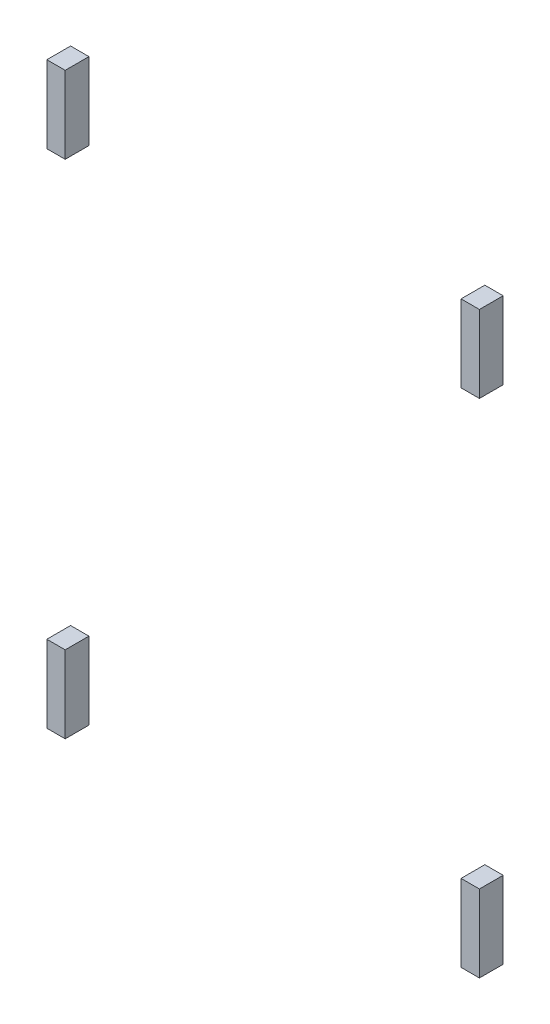
ISO-10303-21;
HEADER;
FILE_DESCRIPTION(('STEP AP214'),'2;1');
FILE_NAME('part.step','',(''),(''),'','','');
FILE_SCHEMA(('AUTOMOTIVE_DESIGN { 1 0 10303 214 1 1 1 1 }'));
ENDSEC;
DATA;
#1=APPLICATION_CONTEXT('core data for automotive mechanical design processes');
#2=APPLICATION_PROTOCOL_DEFINITION('international standard','automotive_design',2000,#1);
#3=PRODUCT_CONTEXT('',#1,'mechanical');
#4=PRODUCT('Part','Part','',(#3));
#5=PRODUCT_RELATED_PRODUCT_CATEGORY('part','',(#4));
#6=PRODUCT_DEFINITION_FORMATION('','',#4);
#7=PRODUCT_DEFINITION_CONTEXT('part definition',#1,'design');
#8=PRODUCT_DEFINITION('design','',#6,#7);
#9=PRODUCT_DEFINITION_SHAPE('','',#8);
#10=(LENGTH_UNIT() NAMED_UNIT(*) SI_UNIT(.MILLI.,.METRE.));
#11=(NAMED_UNIT(*) PLANE_ANGLE_UNIT() SI_UNIT($,.RADIAN.));
#12=(NAMED_UNIT(*) SI_UNIT($,.STERADIAN.) SOLID_ANGLE_UNIT());
#13=UNCERTAINTY_MEASURE_WITH_UNIT(LENGTH_MEASURE(1.E-05),#10,'distance_accuracy_value','');
#14=(GEOMETRIC_REPRESENTATION_CONTEXT(3) GLOBAL_UNCERTAINTY_ASSIGNED_CONTEXT((#13)) GLOBAL_UNIT_ASSIGNED_CONTEXT((#10,
#11,#12)) REPRESENTATION_CONTEXT('',''));
#15=CARTESIAN_POINT('',(0.,0.,0.));
#16=DIRECTION('',(0.,0.,1.));
#17=DIRECTION('',(1.,0.,0.));
#18=AXIS2_PLACEMENT_3D('',#15,#16,#17);
#19=CARTESIAN_POINT('',(-256.75,251.,1970.8));
#20=DIRECTION('',(0.,0.,-1.));
#21=DIRECTION('',(-1.,0.,0.));
#22=AXIS2_PLACEMENT_3D('',#19,#20,#21);
#23=PLANE('',#22);
#24=DIRECTION('',(0.,-1.,0.));
#25=VECTOR('',#24,1.);
#26=CARTESIAN_POINT('',(-280.55,251.,1970.8));
#27=LINE('',#26,#25);
#28=CARTESIAN_POINT('',(-280.55,251.,1970.8));
#29=VERTEX_POINT('',#28);
#30=CARTESIAN_POINT('',(-280.55,151.,1970.8));
#31=VERTEX_POINT('',#30);
#32=EDGE_CURVE('E107',#29,#31,#27,.T.);
#33=ORIENTED_EDGE('',*,*,#32,.F.);
#34=DIRECTION('',(-1.,0.,0.));
#35=VECTOR('',#34,1.);
#36=CARTESIAN_POINT('',(-256.75,251.,1970.8));
#37=LINE('',#36,#35);
#38=CARTESIAN_POINT('',(-256.75,251.,1970.8));
#39=VERTEX_POINT('',#38);
#40=EDGE_CURVE('E12',#39,#29,#37,.T.);
#41=ORIENTED_EDGE('',*,*,#40,.F.);
#42=DIRECTION('',(0.,-1.,0.));
#43=VECTOR('',#42,1.);
#44=CARTESIAN_POINT('',(-256.75,251.,1970.8));
#45=LINE('',#44,#43);
#46=CARTESIAN_POINT('',(-256.75,151.,1970.8));
#47=VERTEX_POINT('',#46);
#48=EDGE_CURVE('E101',#39,#47,#45,.T.);
#49=ORIENTED_EDGE('',*,*,#48,.T.);
#50=DIRECTION('',(-1.,0.,0.));
#51=VECTOR('',#50,1.);
#52=CARTESIAN_POINT('',(-256.75,151.,1970.8));
#53=LINE('',#52,#51);
#54=EDGE_CURVE('E46',#47,#31,#53,.T.);
#55=ORIENTED_EDGE('',*,*,#54,.T.);
#56=EDGE_LOOP('',(#33,#41,#49,#55));
#57=FACE_BOUND('',#56,.T.);
#58=ADVANCED_FACE('F43',(#57),#23,.T.);
#59=CARTESIAN_POINT('',(-256.75,251.,2001.6));
#60=DIRECTION('',(0.,1.,0.));
#61=DIRECTION('',(0.,0.,1.));
#62=AXIS2_PLACEMENT_3D('',#59,#60,#61);
#63=PLANE('',#62);
#64=DIRECTION('',(0.,0.,-1.));
#65=VECTOR('',#64,1.);
#66=CARTESIAN_POINT('',(-280.55,251.,2001.6));
#67=LINE('',#66,#65);
#68=CARTESIAN_POINT('',(-280.55,251.,2001.6));
#69=VERTEX_POINT('',#68);
#70=EDGE_CURVE('E103',#69,#29,#67,.T.);
#71=ORIENTED_EDGE('',*,*,#70,.F.);
#72=DIRECTION('',(-1.,0.,0.));
#73=VECTOR('',#72,1.);
#74=CARTESIAN_POINT('',(-256.75,251.,2001.6));
#75=LINE('',#74,#73);
#76=CARTESIAN_POINT('',(-256.75,251.,2001.6));
#77=VERTEX_POINT('',#76);
#78=EDGE_CURVE('E52',#77,#69,#75,.T.);
#79=ORIENTED_EDGE('',*,*,#78,.F.);
#80=DIRECTION('',(0.,0.,-1.));
#81=VECTOR('',#80,1.);
#82=CARTESIAN_POINT('',(-256.75,251.,2001.6));
#83=LINE('',#82,#81);
#84=EDGE_CURVE('E98',#77,#39,#83,.T.);
#85=ORIENTED_EDGE('',*,*,#84,.T.);
#86=ORIENTED_EDGE('',*,*,#40,.T.);
#87=EDGE_LOOP('',(#71,#79,#85,#86));
#88=FACE_BOUND('',#87,.T.);
#89=ADVANCED_FACE('F117',(#88),#63,.T.);
#90=CARTESIAN_POINT('',(-256.75,151.,2001.6));
#91=DIRECTION('',(0.,0.,1.));
#92=DIRECTION('',(1.,0.,0.));
#93=AXIS2_PLACEMENT_3D('',#90,#91,#92);
#94=PLANE('',#93);
#95=DIRECTION('',(0.,1.,0.));
#96=VECTOR('',#95,1.);
#97=CARTESIAN_POINT('',(-280.55,151.,2001.6));
#98=LINE('',#97,#96);
#99=CARTESIAN_POINT('',(-280.55,151.,2001.6));
#100=VERTEX_POINT('',#99);
#101=EDGE_CURVE('E93',#100,#69,#98,.T.);
#102=ORIENTED_EDGE('',*,*,#101,.F.);
#103=DIRECTION('',(-1.,0.,0.));
#104=VECTOR('',#103,1.);
#105=CARTESIAN_POINT('',(-256.75,151.,2001.6));
#106=LINE('',#105,#104);
#107=CARTESIAN_POINT('',(-256.75,151.,2001.6));
#108=VERTEX_POINT('',#107);
#109=EDGE_CURVE('E88',#108,#100,#106,.T.);
#110=ORIENTED_EDGE('',*,*,#109,.F.);
#111=DIRECTION('',(0.,1.,0.));
#112=VECTOR('',#111,1.);
#113=CARTESIAN_POINT('',(-256.75,151.,2001.6));
#114=LINE('',#113,#112);
#115=EDGE_CURVE('E91',#108,#77,#114,.T.);
#116=ORIENTED_EDGE('',*,*,#115,.T.);
#117=ORIENTED_EDGE('',*,*,#78,.T.);
#118=EDGE_LOOP('',(#102,#110,#116,#117));
#119=FACE_BOUND('',#118,.T.);
#120=ADVANCED_FACE('F90',(#119),#94,.T.);
#121=CARTESIAN_POINT('',(-256.75,151.,1970.8));
#122=DIRECTION('',(0.,-1.,0.));
#123=DIRECTION('',(0.,0.,-1.));
#124=AXIS2_PLACEMENT_3D('',#121,#122,#123);
#125=PLANE('',#124);
#126=DIRECTION('',(0.,0.,1.));
#127=VECTOR('',#126,1.);
#128=CARTESIAN_POINT('',(-280.55,151.,1970.8));
#129=LINE('',#128,#127);
#130=EDGE_CURVE('E110',#31,#100,#129,.T.);
#131=ORIENTED_EDGE('',*,*,#130,.F.);
#132=ORIENTED_EDGE('',*,*,#54,.F.);
#133=DIRECTION('',(0.,0.,1.));
#134=VECTOR('',#133,1.);
#135=CARTESIAN_POINT('',(-256.75,151.,1970.8));
#136=LINE('',#135,#134);
#137=EDGE_CURVE('E97',#47,#108,#136,.T.);
#138=ORIENTED_EDGE('',*,*,#137,.T.);
#139=ORIENTED_EDGE('',*,*,#109,.T.);
#140=EDGE_LOOP('',(#131,#132,#138,#139));
#141=FACE_BOUND('',#140,.T.);
#142=ADVANCED_FACE('F100',(#141),#125,.T.);
#143=CARTESIAN_POINT('',(-256.75,0.,0.));
#144=DIRECTION('',(-1.,0.,0.));
#145=DIRECTION('',(0.,0.,1.));
#146=AXIS2_PLACEMENT_3D('',#143,#144,#145);
#147=PLANE('',#146);
#148=ORIENTED_EDGE('',*,*,#48,.F.);
#149=ORIENTED_EDGE('',*,*,#84,.F.);
#150=ORIENTED_EDGE('',*,*,#115,.F.);
#151=ORIENTED_EDGE('',*,*,#137,.F.);
#152=EDGE_LOOP('',(#148,#149,#150,#151));
#153=FACE_BOUND('',#152,.T.);
#154=ADVANCED_FACE('F96',(#153),#147,.F.);
#155=CARTESIAN_POINT('',(-280.55,0.,0.));
#156=DIRECTION('',(-1.,0.,0.));
#157=DIRECTION('',(0.,0.,1.));
#158=AXIS2_PLACEMENT_3D('',#155,#156,#157);
#159=PLANE('',#158);
#160=ORIENTED_EDGE('',*,*,#32,.T.);
#161=ORIENTED_EDGE('',*,*,#130,.T.);
#162=ORIENTED_EDGE('',*,*,#101,.T.);
#163=ORIENTED_EDGE('',*,*,#70,.T.);
#164=EDGE_LOOP('',(#160,#161,#162,#163));
#165=FACE_BOUND('',#164,.T.);
#166=ADVANCED_FACE('F116',(#165),#159,.T.);
#167=CLOSED_SHELL('',(#58,#89,#120,#142,#154,#166));
#168=MANIFOLD_SOLID_BREP('B2',#167);
#169=CARTESIAN_POINT('',(-256.75,-400.,1970.8));
#170=DIRECTION('',(0.,0.,-1.));
#171=DIRECTION('',(-1.,0.,0.));
#172=AXIS2_PLACEMENT_3D('',#169,#170,#171);
#173=PLANE('',#172);
#174=DIRECTION('',(0.,-1.,0.));
#175=VECTOR('',#174,1.);
#176=CARTESIAN_POINT('',(-280.55,-400.,1970.8));
#177=LINE('',#176,#175);
#178=CARTESIAN_POINT('',(-280.55,-400.,1970.8));
#179=VERTEX_POINT('',#178);
#180=CARTESIAN_POINT('',(-280.55,-500.,1970.8));
#181=VERTEX_POINT('',#180);
#182=EDGE_CURVE('E240',#179,#181,#177,.T.);
#183=ORIENTED_EDGE('',*,*,#182,.F.);
#184=DIRECTION('',(-1.,0.,0.));
#185=VECTOR('',#184,1.);
#186=CARTESIAN_POINT('',(-256.75,-400.,1970.8));
#187=LINE('',#186,#185);
#188=CARTESIAN_POINT('',(-256.75,-400.,1970.8));
#189=VERTEX_POINT('',#188);
#190=EDGE_CURVE('E41',#189,#179,#187,.T.);
#191=ORIENTED_EDGE('',*,*,#190,.F.);
#192=DIRECTION('',(0.,-1.,0.));
#193=VECTOR('',#192,1.);
#194=CARTESIAN_POINT('',(-256.75,-400.,1970.8));
#195=LINE('',#194,#193);
#196=CARTESIAN_POINT('',(-256.75,-500.,1970.8));
#197=VERTEX_POINT('',#196);
#198=EDGE_CURVE('E234',#189,#197,#195,.T.);
#199=ORIENTED_EDGE('',*,*,#198,.T.);
#200=DIRECTION('',(-1.,0.,0.));
#201=VECTOR('',#200,1.);
#202=CARTESIAN_POINT('',(-256.75,-500.,1970.8));
#203=LINE('',#202,#201);
#204=EDGE_CURVE('E179',#197,#181,#203,.T.);
#205=ORIENTED_EDGE('',*,*,#204,.T.);
#206=EDGE_LOOP('',(#183,#191,#199,#205));
#207=FACE_BOUND('',#206,.T.);
#208=ADVANCED_FACE('F176',(#207),#173,.T.);
#209=CARTESIAN_POINT('',(-256.75,-400.,2001.6));
#210=DIRECTION('',(0.,1.,0.));
#211=DIRECTION('',(0.,0.,1.));
#212=AXIS2_PLACEMENT_3D('',#209,#210,#211);
#213=PLANE('',#212);
#214=DIRECTION('',(0.,0.,-1.));
#215=VECTOR('',#214,1.);
#216=CARTESIAN_POINT('',(-280.55,-400.,2001.6));
#217=LINE('',#216,#215);
#218=CARTESIAN_POINT('',(-280.55,-400.,2001.6));
#219=VERTEX_POINT('',#218);
#220=EDGE_CURVE('E236',#219,#179,#217,.T.);
#221=ORIENTED_EDGE('',*,*,#220,.F.);
#222=DIRECTION('',(-1.,0.,0.));
#223=VECTOR('',#222,1.);
#224=CARTESIAN_POINT('',(-256.75,-400.,2001.6));
#225=LINE('',#224,#223);
#226=CARTESIAN_POINT('',(-256.75,-400.,2001.6));
#227=VERTEX_POINT('',#226);
#228=EDGE_CURVE('E185',#227,#219,#225,.T.);
#229=ORIENTED_EDGE('',*,*,#228,.F.);
#230=DIRECTION('',(0.,0.,-1.));
#231=VECTOR('',#230,1.);
#232=CARTESIAN_POINT('',(-256.75,-400.,2001.6));
#233=LINE('',#232,#231);
#234=EDGE_CURVE('E231',#227,#189,#233,.T.);
#235=ORIENTED_EDGE('',*,*,#234,.T.);
#236=ORIENTED_EDGE('',*,*,#190,.T.);
#237=EDGE_LOOP('',(#221,#229,#235,#236));
#238=FACE_BOUND('',#237,.T.);
#239=ADVANCED_FACE('F250',(#238),#213,.T.);
#240=CARTESIAN_POINT('',(-256.75,-500.,2001.6));
#241=DIRECTION('',(0.,0.,1.));
#242=DIRECTION('',(1.,0.,0.));
#243=AXIS2_PLACEMENT_3D('',#240,#241,#242);
#244=PLANE('',#243);
#245=DIRECTION('',(0.,1.,0.));
#246=VECTOR('',#245,1.);
#247=CARTESIAN_POINT('',(-280.55,-500.,2001.6));
#248=LINE('',#247,#246);
#249=CARTESIAN_POINT('',(-280.55,-500.,2001.6));
#250=VERTEX_POINT('',#249);
#251=EDGE_CURVE('E226',#250,#219,#248,.T.);
#252=ORIENTED_EDGE('',*,*,#251,.F.);
#253=DIRECTION('',(-1.,0.,0.));
#254=VECTOR('',#253,1.);
#255=CARTESIAN_POINT('',(-256.75,-500.,2001.6));
#256=LINE('',#255,#254);
#257=CARTESIAN_POINT('',(-256.75,-500.,2001.6));
#258=VERTEX_POINT('',#257);
#259=EDGE_CURVE('E221',#258,#250,#256,.T.);
#260=ORIENTED_EDGE('',*,*,#259,.F.);
#261=DIRECTION('',(0.,1.,0.));
#262=VECTOR('',#261,1.);
#263=CARTESIAN_POINT('',(-256.75,-500.,2001.6));
#264=LINE('',#263,#262);
#265=EDGE_CURVE('E224',#258,#227,#264,.T.);
#266=ORIENTED_EDGE('',*,*,#265,.T.);
#267=ORIENTED_EDGE('',*,*,#228,.T.);
#268=EDGE_LOOP('',(#252,#260,#266,#267));
#269=FACE_BOUND('',#268,.T.);
#270=ADVANCED_FACE('F223',(#269),#244,.T.);
#271=CARTESIAN_POINT('',(-256.75,-500.,1970.8));
#272=DIRECTION('',(0.,-1.,0.));
#273=DIRECTION('',(0.,0.,-1.));
#274=AXIS2_PLACEMENT_3D('',#271,#272,#273);
#275=PLANE('',#274);
#276=DIRECTION('',(0.,0.,1.));
#277=VECTOR('',#276,1.);
#278=CARTESIAN_POINT('',(-280.55,-500.,1970.8));
#279=LINE('',#278,#277);
#280=EDGE_CURVE('E243',#181,#250,#279,.T.);
#281=ORIENTED_EDGE('',*,*,#280,.F.);
#282=ORIENTED_EDGE('',*,*,#204,.F.);
#283=DIRECTION('',(0.,0.,1.));
#284=VECTOR('',#283,1.);
#285=CARTESIAN_POINT('',(-256.75,-500.,1970.8));
#286=LINE('',#285,#284);
#287=EDGE_CURVE('E230',#197,#258,#286,.T.);
#288=ORIENTED_EDGE('',*,*,#287,.T.);
#289=ORIENTED_EDGE('',*,*,#259,.T.);
#290=EDGE_LOOP('',(#281,#282,#288,#289));
#291=FACE_BOUND('',#290,.T.);
#292=ADVANCED_FACE('F233',(#291),#275,.T.);
#293=CARTESIAN_POINT('',(-256.75,0.,0.));
#294=DIRECTION('',(-1.,0.,0.));
#295=DIRECTION('',(0.,0.,1.));
#296=AXIS2_PLACEMENT_3D('',#293,#294,#295);
#297=PLANE('',#296);
#298=ORIENTED_EDGE('',*,*,#198,.F.);
#299=ORIENTED_EDGE('',*,*,#234,.F.);
#300=ORIENTED_EDGE('',*,*,#265,.F.);
#301=ORIENTED_EDGE('',*,*,#287,.F.);
#302=EDGE_LOOP('',(#298,#299,#300,#301));
#303=FACE_BOUND('',#302,.T.);
#304=ADVANCED_FACE('F229',(#303),#297,.F.);
#305=CARTESIAN_POINT('',(-280.55,0.,0.));
#306=DIRECTION('',(-1.,0.,0.));
#307=DIRECTION('',(0.,0.,1.));
#308=AXIS2_PLACEMENT_3D('',#305,#306,#307);
#309=PLANE('',#308);
#310=ORIENTED_EDGE('',*,*,#182,.T.);
#311=ORIENTED_EDGE('',*,*,#280,.T.);
#312=ORIENTED_EDGE('',*,*,#251,.T.);
#313=ORIENTED_EDGE('',*,*,#220,.T.);
#314=EDGE_LOOP('',(#310,#311,#312,#313));
#315=FACE_BOUND('',#314,.T.);
#316=ADVANCED_FACE('F249',(#315),#309,.T.);
#317=CLOSED_SHELL('',(#208,#239,#270,#292,#304,#316));
#318=MANIFOLD_SOLID_BREP('B6',#317);
#319=CARTESIAN_POINT('',(256.75,151.,2001.6));
#320=DIRECTION('',(0.,-1.,0.));
#321=DIRECTION('',(0.,0.,-1.));
#322=AXIS2_PLACEMENT_3D('',#319,#320,#321);
#323=PLANE('',#322);
#324=DIRECTION('',(0.,0.,-1.));
#325=VECTOR('',#324,1.);
#326=CARTESIAN_POINT('',(280.55,151.,2001.6));
#327=LINE('',#326,#325);
#328=CARTESIAN_POINT('',(280.55,151.,2001.6));
#329=VERTEX_POINT('',#328);
#330=CARTESIAN_POINT('',(280.55,151.,1970.8));
#331=VERTEX_POINT('',#330);
#332=EDGE_CURVE('E372',#329,#331,#327,.T.);
#333=ORIENTED_EDGE('',*,*,#332,.F.);
#334=DIRECTION('',(1.,0.,0.));
#335=VECTOR('',#334,1.);
#336=CARTESIAN_POINT('',(256.75,151.,2001.6));
#337=LINE('',#336,#335);
#338=CARTESIAN_POINT('',(256.75,151.,2001.6));
#339=VERTEX_POINT('',#338);
#340=EDGE_CURVE('E174',#339,#329,#337,.T.);
#341=ORIENTED_EDGE('',*,*,#340,.F.);
#342=DIRECTION('',(0.,0.,-1.));
#343=VECTOR('',#342,1.);
#344=CARTESIAN_POINT('',(256.75,151.,2001.6));
#345=LINE('',#344,#343);
#346=CARTESIAN_POINT('',(256.75,151.,1970.8));
#347=VERTEX_POINT('',#346);
#348=EDGE_CURVE('E366',#339,#347,#345,.T.);
#349=ORIENTED_EDGE('',*,*,#348,.T.);
#350=DIRECTION('',(1.,0.,0.));
#351=VECTOR('',#350,1.);
#352=CARTESIAN_POINT('',(256.75,151.,1970.8));
#353=LINE('',#352,#351);
#354=EDGE_CURVE('E311',#347,#331,#353,.T.);
#355=ORIENTED_EDGE('',*,*,#354,.T.);
#356=EDGE_LOOP('',(#333,#341,#349,#355));
#357=FACE_BOUND('',#356,.T.);
#358=ADVANCED_FACE('F308',(#357),#323,.T.);
#359=CARTESIAN_POINT('',(256.75,251.,2001.6));
#360=DIRECTION('',(0.,0.,1.));
#361=DIRECTION('',(1.,0.,0.));
#362=AXIS2_PLACEMENT_3D('',#359,#360,#361);
#363=PLANE('',#362);
#364=DIRECTION('',(0.,-1.,0.));
#365=VECTOR('',#364,1.);
#366=CARTESIAN_POINT('',(280.55,251.,2001.6));
#367=LINE('',#366,#365);
#368=CARTESIAN_POINT('',(280.55,251.,2001.6));
#369=VERTEX_POINT('',#368);
#370=EDGE_CURVE('E368',#369,#329,#367,.T.);
#371=ORIENTED_EDGE('',*,*,#370,.F.);
#372=DIRECTION('',(1.,0.,0.));
#373=VECTOR('',#372,1.);
#374=CARTESIAN_POINT('',(256.75,251.,2001.6));
#375=LINE('',#374,#373);
#376=CARTESIAN_POINT('',(256.75,251.,2001.6));
#377=VERTEX_POINT('',#376);
#378=EDGE_CURVE('E317',#377,#369,#375,.T.);
#379=ORIENTED_EDGE('',*,*,#378,.F.);
#380=DIRECTION('',(0.,-1.,0.));
#381=VECTOR('',#380,1.);
#382=CARTESIAN_POINT('',(256.75,251.,2001.6));
#383=LINE('',#382,#381);
#384=EDGE_CURVE('E363',#377,#339,#383,.T.);
#385=ORIENTED_EDGE('',*,*,#384,.T.);
#386=ORIENTED_EDGE('',*,*,#340,.T.);
#387=EDGE_LOOP('',(#371,#379,#385,#386));
#388=FACE_BOUND('',#387,.T.);
#389=ADVANCED_FACE('F382',(#388),#363,.T.);
#390=CARTESIAN_POINT('',(256.75,251.,1970.8));
#391=DIRECTION('',(0.,1.,0.));
#392=DIRECTION('',(0.,0.,1.));
#393=AXIS2_PLACEMENT_3D('',#390,#391,#392);
#394=PLANE('',#393);
#395=DIRECTION('',(0.,0.,1.));
#396=VECTOR('',#395,1.);
#397=CARTESIAN_POINT('',(280.55,251.,1970.8));
#398=LINE('',#397,#396);
#399=CARTESIAN_POINT('',(280.55,251.,1970.8));
#400=VERTEX_POINT('',#399);
#401=EDGE_CURVE('E358',#400,#369,#398,.T.);
#402=ORIENTED_EDGE('',*,*,#401,.F.);
#403=DIRECTION('',(1.,0.,0.));
#404=VECTOR('',#403,1.);
#405=CARTESIAN_POINT('',(256.75,251.,1970.8));
#406=LINE('',#405,#404);
#407=CARTESIAN_POINT('',(256.75,251.,1970.8));
#408=VERTEX_POINT('',#407);
#409=EDGE_CURVE('E353',#408,#400,#406,.T.);
#410=ORIENTED_EDGE('',*,*,#409,.F.);
#411=DIRECTION('',(0.,0.,1.));
#412=VECTOR('',#411,1.);
#413=CARTESIAN_POINT('',(256.75,251.,1970.8));
#414=LINE('',#413,#412);
#415=EDGE_CURVE('E356',#408,#377,#414,.T.);
#416=ORIENTED_EDGE('',*,*,#415,.T.);
#417=ORIENTED_EDGE('',*,*,#378,.T.);
#418=EDGE_LOOP('',(#402,#410,#416,#417));
#419=FACE_BOUND('',#418,.T.);
#420=ADVANCED_FACE('F355',(#419),#394,.T.);
#421=CARTESIAN_POINT('',(256.75,151.,1970.8));
#422=DIRECTION('',(0.,0.,-1.));
#423=DIRECTION('',(-1.,0.,0.));
#424=AXIS2_PLACEMENT_3D('',#421,#422,#423);
#425=PLANE('',#424);
#426=DIRECTION('',(0.,1.,0.));
#427=VECTOR('',#426,1.);
#428=CARTESIAN_POINT('',(280.55,151.,1970.8));
#429=LINE('',#428,#427);
#430=EDGE_CURVE('E375',#331,#400,#429,.T.);
#431=ORIENTED_EDGE('',*,*,#430,.F.);
#432=ORIENTED_EDGE('',*,*,#354,.F.);
#433=DIRECTION('',(0.,1.,0.));
#434=VECTOR('',#433,1.);
#435=CARTESIAN_POINT('',(256.75,151.,1970.8));
#436=LINE('',#435,#434);
#437=EDGE_CURVE('E362',#347,#408,#436,.T.);
#438=ORIENTED_EDGE('',*,*,#437,.T.);
#439=ORIENTED_EDGE('',*,*,#409,.T.);
#440=EDGE_LOOP('',(#431,#432,#438,#439));
#441=FACE_BOUND('',#440,.T.);
#442=ADVANCED_FACE('F365',(#441),#425,.T.);
#443=CARTESIAN_POINT('',(256.75,0.,0.));
#444=DIRECTION('',(1.,0.,0.));
#445=DIRECTION('',(0.,0.,-1.));
#446=AXIS2_PLACEMENT_3D('',#443,#444,#445);
#447=PLANE('',#446);
#448=ORIENTED_EDGE('',*,*,#348,.F.);
#449=ORIENTED_EDGE('',*,*,#384,.F.);
#450=ORIENTED_EDGE('',*,*,#415,.F.);
#451=ORIENTED_EDGE('',*,*,#437,.F.);
#452=EDGE_LOOP('',(#448,#449,#450,#451));
#453=FACE_BOUND('',#452,.T.);
#454=ADVANCED_FACE('F361',(#453),#447,.F.);
#455=CARTESIAN_POINT('',(280.55,0.,0.));
#456=DIRECTION('',(1.,0.,0.));
#457=DIRECTION('',(0.,0.,-1.));
#458=AXIS2_PLACEMENT_3D('',#455,#456,#457);
#459=PLANE('',#458);
#460=ORIENTED_EDGE('',*,*,#332,.T.);
#461=ORIENTED_EDGE('',*,*,#430,.T.);
#462=ORIENTED_EDGE('',*,*,#401,.T.);
#463=ORIENTED_EDGE('',*,*,#370,.T.);
#464=EDGE_LOOP('',(#460,#461,#462,#463));
#465=FACE_BOUND('',#464,.T.);
#466=ADVANCED_FACE('F381',(#465),#459,.T.);
#467=CLOSED_SHELL('',(#358,#389,#420,#442,#454,#466));
#468=MANIFOLD_SOLID_BREP('B35',#467);
#469=CARTESIAN_POINT('',(256.75,-500.,2001.6));
#470=DIRECTION('',(0.,-1.,0.));
#471=DIRECTION('',(0.,0.,-1.));
#472=AXIS2_PLACEMENT_3D('',#469,#470,#471);
#473=PLANE('',#472);
#474=DIRECTION('',(0.,0.,-1.));
#475=VECTOR('',#474,1.);
#476=CARTESIAN_POINT('',(280.55,-500.,2001.6));
#477=LINE('',#476,#475);
#478=CARTESIAN_POINT('',(280.55,-500.,2001.6));
#479=VERTEX_POINT('',#478);
#480=CARTESIAN_POINT('',(280.55,-500.,1970.8));
#481=VERTEX_POINT('',#480);
#482=EDGE_CURVE('E495',#479,#481,#477,.T.);
#483=ORIENTED_EDGE('',*,*,#482,.F.);
#484=DIRECTION('',(1.,0.,0.));
#485=VECTOR('',#484,1.);
#486=CARTESIAN_POINT('',(256.75,-500.,2001.6));
#487=LINE('',#486,#485);
#488=CARTESIAN_POINT('',(256.75,-500.,2001.6));
#489=VERTEX_POINT('',#488);
#490=EDGE_CURVE('E306',#489,#479,#487,.T.);
#491=ORIENTED_EDGE('',*,*,#490,.F.);
#492=DIRECTION('',(0.,0.,-1.));
#493=VECTOR('',#492,1.);
#494=CARTESIAN_POINT('',(256.75,-500.,2001.6));
#495=LINE('',#494,#493);
#496=CARTESIAN_POINT('',(256.75,-500.,1970.8));
#497=VERTEX_POINT('',#496);
#498=EDGE_CURVE('E489',#489,#497,#495,.T.);
#499=ORIENTED_EDGE('',*,*,#498,.T.);
#500=DIRECTION('',(1.,0.,0.));
#501=VECTOR('',#500,1.);
#502=CARTESIAN_POINT('',(256.75,-500.,1970.8));
#503=LINE('',#502,#501);
#504=EDGE_CURVE('E434',#497,#481,#503,.T.);
#505=ORIENTED_EDGE('',*,*,#504,.T.);
#506=EDGE_LOOP('',(#483,#491,#499,#505));
#507=FACE_BOUND('',#506,.T.);
#508=ADVANCED_FACE('F431',(#507),#473,.T.);
#509=CARTESIAN_POINT('',(256.75,-400.,2001.6));
#510=DIRECTION('',(0.,0.,1.));
#511=DIRECTION('',(1.,0.,0.));
#512=AXIS2_PLACEMENT_3D('',#509,#510,#511);
#513=PLANE('',#512);
#514=DIRECTION('',(0.,-1.,0.));
#515=VECTOR('',#514,1.);
#516=CARTESIAN_POINT('',(280.55,-400.,2001.6));
#517=LINE('',#516,#515);
#518=CARTESIAN_POINT('',(280.55,-400.,2001.6));
#519=VERTEX_POINT('',#518);
#520=EDGE_CURVE('E491',#519,#479,#517,.T.);
#521=ORIENTED_EDGE('',*,*,#520,.F.);
#522=DIRECTION('',(1.,0.,0.));
#523=VECTOR('',#522,1.);
#524=CARTESIAN_POINT('',(256.75,-400.,2001.6));
#525=LINE('',#524,#523);
#526=CARTESIAN_POINT('',(256.75,-400.,2001.6));
#527=VERTEX_POINT('',#526);
#528=EDGE_CURVE('E440',#527,#519,#525,.T.);
#529=ORIENTED_EDGE('',*,*,#528,.F.);
#530=DIRECTION('',(0.,-1.,0.));
#531=VECTOR('',#530,1.);
#532=CARTESIAN_POINT('',(256.75,-400.,2001.6));
#533=LINE('',#532,#531);
#534=EDGE_CURVE('E486',#527,#489,#533,.T.);
#535=ORIENTED_EDGE('',*,*,#534,.T.);
#536=ORIENTED_EDGE('',*,*,#490,.T.);
#537=EDGE_LOOP('',(#521,#529,#535,#536));
#538=FACE_BOUND('',#537,.T.);
#539=ADVANCED_FACE('F505',(#538),#513,.T.);
#540=CARTESIAN_POINT('',(256.75,-400.,1970.8));
#541=DIRECTION('',(0.,1.,0.));
#542=DIRECTION('',(0.,0.,1.));
#543=AXIS2_PLACEMENT_3D('',#540,#541,#542);
#544=PLANE('',#543);
#545=DIRECTION('',(0.,0.,1.));
#546=VECTOR('',#545,1.);
#547=CARTESIAN_POINT('',(280.55,-400.,1970.8));
#548=LINE('',#547,#546);
#549=CARTESIAN_POINT('',(280.55,-400.,1970.8));
#550=VERTEX_POINT('',#549);
#551=EDGE_CURVE('E481',#550,#519,#548,.T.);
#552=ORIENTED_EDGE('',*,*,#551,.F.);
#553=DIRECTION('',(1.,0.,0.));
#554=VECTOR('',#553,1.);
#555=CARTESIAN_POINT('',(256.75,-400.,1970.8));
#556=LINE('',#555,#554);
#557=CARTESIAN_POINT('',(256.75,-400.,1970.8));
#558=VERTEX_POINT('',#557);
#559=EDGE_CURVE('E476',#558,#550,#556,.T.);
#560=ORIENTED_EDGE('',*,*,#559,.F.);
#561=DIRECTION('',(0.,0.,1.));
#562=VECTOR('',#561,1.);
#563=CARTESIAN_POINT('',(256.75,-400.,1970.8));
#564=LINE('',#563,#562);
#565=EDGE_CURVE('E479',#558,#527,#564,.T.);
#566=ORIENTED_EDGE('',*,*,#565,.T.);
#567=ORIENTED_EDGE('',*,*,#528,.T.);
#568=EDGE_LOOP('',(#552,#560,#566,#567));
#569=FACE_BOUND('',#568,.T.);
#570=ADVANCED_FACE('F478',(#569),#544,.T.);
#571=CARTESIAN_POINT('',(256.75,-500.,1970.8));
#572=DIRECTION('',(0.,0.,-1.));
#573=DIRECTION('',(-1.,0.,0.));
#574=AXIS2_PLACEMENT_3D('',#571,#572,#573);
#575=PLANE('',#574);
#576=DIRECTION('',(0.,1.,0.));
#577=VECTOR('',#576,1.);
#578=CARTESIAN_POINT('',(280.55,-500.,1970.8));
#579=LINE('',#578,#577);
#580=EDGE_CURVE('E498',#481,#550,#579,.T.);
#581=ORIENTED_EDGE('',*,*,#580,.F.);
#582=ORIENTED_EDGE('',*,*,#504,.F.);
#583=DIRECTION('',(0.,1.,0.));
#584=VECTOR('',#583,1.);
#585=CARTESIAN_POINT('',(256.75,-500.,1970.8));
#586=LINE('',#585,#584);
#587=EDGE_CURVE('E485',#497,#558,#586,.T.);
#588=ORIENTED_EDGE('',*,*,#587,.T.);
#589=ORIENTED_EDGE('',*,*,#559,.T.);
#590=EDGE_LOOP('',(#581,#582,#588,#589));
#591=FACE_BOUND('',#590,.T.);
#592=ADVANCED_FACE('F488',(#591),#575,.T.);
#593=CARTESIAN_POINT('',(256.75,0.,0.));
#594=DIRECTION('',(1.,0.,0.));
#595=DIRECTION('',(0.,0.,-1.));
#596=AXIS2_PLACEMENT_3D('',#593,#594,#595);
#597=PLANE('',#596);
#598=ORIENTED_EDGE('',*,*,#498,.F.);
#599=ORIENTED_EDGE('',*,*,#534,.F.);
#600=ORIENTED_EDGE('',*,*,#565,.F.);
#601=ORIENTED_EDGE('',*,*,#587,.F.);
#602=EDGE_LOOP('',(#598,#599,#600,#601));
#603=FACE_BOUND('',#602,.T.);
#604=ADVANCED_FACE('F484',(#603),#597,.F.);
#605=CARTESIAN_POINT('',(280.55,0.,0.));
#606=DIRECTION('',(1.,0.,0.));
#607=DIRECTION('',(0.,0.,-1.));
#608=AXIS2_PLACEMENT_3D('',#605,#606,#607);
#609=PLANE('',#608);
#610=ORIENTED_EDGE('',*,*,#482,.T.);
#611=ORIENTED_EDGE('',*,*,#580,.T.);
#612=ORIENTED_EDGE('',*,*,#551,.T.);
#613=ORIENTED_EDGE('',*,*,#520,.T.);
#614=EDGE_LOOP('',(#610,#611,#612,#613));
#615=FACE_BOUND('',#614,.T.);
#616=ADVANCED_FACE('F504',(#615),#609,.T.);
#617=CLOSED_SHELL('',(#508,#539,#570,#592,#604,#616));
#618=MANIFOLD_SOLID_BREP('B168',#617);
#619=ADVANCED_BREP_SHAPE_REPRESENTATION('',(#18,#168,#318,#468,#618),#14);
#620=SHAPE_DEFINITION_REPRESENTATION(#9,#619);
ENDSEC;
END-ISO-10303-21;
